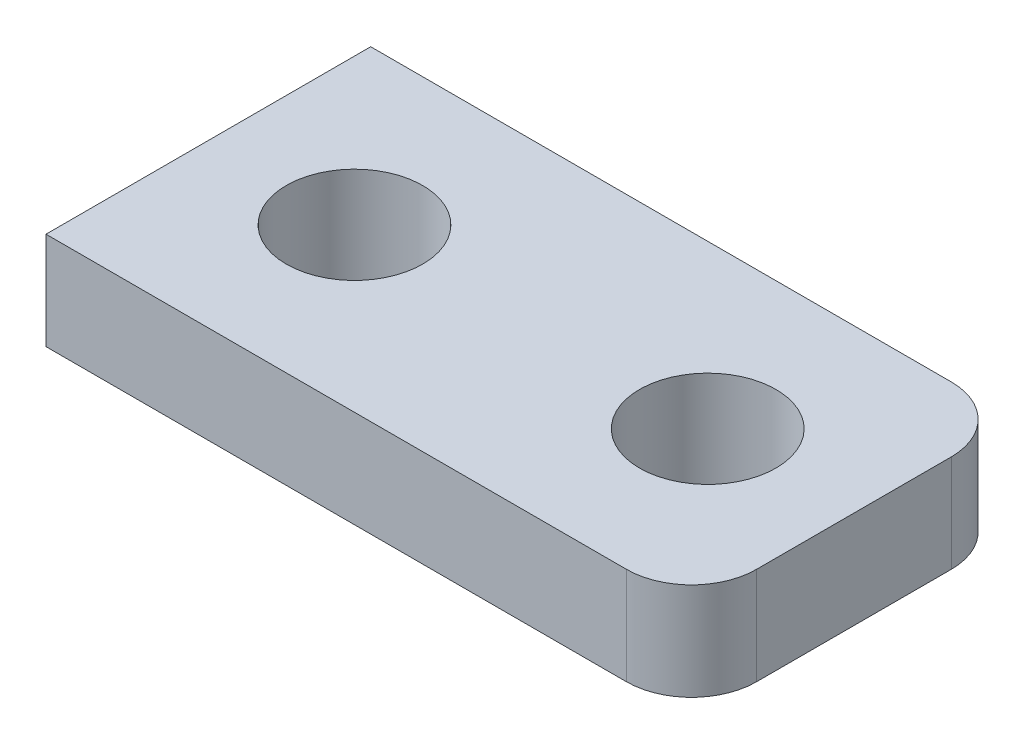
ISO-10303-21;
HEADER;
FILE_DESCRIPTION(('STEP AP214'),'2;1');
FILE_NAME('part.step','',(''),(''),'','','');
FILE_SCHEMA(('AUTOMOTIVE_DESIGN { 1 0 10303 214 1 1 1 1 }'));
ENDSEC;
DATA;
#1=APPLICATION_CONTEXT('core data for automotive mechanical design processes');
#2=APPLICATION_PROTOCOL_DEFINITION('international standard','automotive_design',2000,#1);
#3=PRODUCT_CONTEXT('',#1,'mechanical');
#4=PRODUCT('Part','Part','',(#3));
#5=PRODUCT_RELATED_PRODUCT_CATEGORY('part','',(#4));
#6=PRODUCT_DEFINITION_FORMATION('','',#4);
#7=PRODUCT_DEFINITION_CONTEXT('part definition',#1,'design');
#8=PRODUCT_DEFINITION('design','',#6,#7);
#9=PRODUCT_DEFINITION_SHAPE('','',#8);
#10=(LENGTH_UNIT() NAMED_UNIT(*) SI_UNIT(.MILLI.,.METRE.));
#11=(NAMED_UNIT(*) PLANE_ANGLE_UNIT() SI_UNIT($,.RADIAN.));
#12=(NAMED_UNIT(*) SI_UNIT($,.STERADIAN.) SOLID_ANGLE_UNIT());
#13=UNCERTAINTY_MEASURE_WITH_UNIT(LENGTH_MEASURE(1.E-05),#10,'distance_accuracy_value','');
#14=(GEOMETRIC_REPRESENTATION_CONTEXT(3) GLOBAL_UNCERTAINTY_ASSIGNED_CONTEXT((#13)) GLOBAL_UNIT_ASSIGNED_CONTEXT((#10,
#11,#12)) REPRESENTATION_CONTEXT('',''));
#15=CARTESIAN_POINT('',(0.,0.,0.));
#16=DIRECTION('',(0.,0.,1.));
#17=DIRECTION('',(1.,0.,0.));
#18=AXIS2_PLACEMENT_3D('',#15,#16,#17);
#19=CARTESIAN_POINT('',(0.,3.,0.));
#20=DIRECTION('',(1.,0.,0.));
#21=DIRECTION('',(0.,0.,-1.));
#22=AXIS2_PLACEMENT_3D('',#19,#20,#21);
#23=PLANE('',#22);
#24=DIRECTION('',(0.,0.,1.));
#25=VECTOR('',#24,1.);
#26=CARTESIAN_POINT('',(0.,0.,0.));
#27=LINE('',#26,#25);
#28=CARTESIAN_POINT('',(0.,0.,-10.));
#29=VERTEX_POINT('',#28);
#30=CARTESIAN_POINT('',(0.,0.,0.));
#31=VERTEX_POINT('',#30);
#32=EDGE_CURVE('E113',#29,#31,#27,.T.);
#33=ORIENTED_EDGE('',*,*,#32,.T.);
#34=DIRECTION('',(0.,-1.,0.));
#35=VECTOR('',#34,1.);
#36=CARTESIAN_POINT('',(0.,3.,0.));
#37=LINE('',#36,#35);
#38=CARTESIAN_POINT('',(0.,3.,0.));
#39=VERTEX_POINT('',#38);
#40=EDGE_CURVE('E96',#39,#31,#37,.T.);
#41=ORIENTED_EDGE('',*,*,#40,.F.);
#42=DIRECTION('',(0.,0.,1.));
#43=VECTOR('',#42,1.);
#44=CARTESIAN_POINT('',(0.,3.,0.));
#45=LINE('',#44,#43);
#46=CARTESIAN_POINT('',(0.,3.,-10.));
#47=VERTEX_POINT('',#46);
#48=EDGE_CURVE('E101',#47,#39,#45,.T.);
#49=ORIENTED_EDGE('',*,*,#48,.F.);
#50=DIRECTION('',(0.,-1.,0.));
#51=VECTOR('',#50,1.);
#52=CARTESIAN_POINT('',(0.,3.,-10.));
#53=LINE('',#52,#51);
#54=EDGE_CURVE('E116',#47,#29,#53,.T.);
#55=ORIENTED_EDGE('',*,*,#54,.T.);
#56=EDGE_LOOP('',(#33,#41,#49,#55));
#57=FACE_BOUND('',#56,.T.);
#58=ADVANCED_FACE('F38',(#57),#23,.F.);
#59=CARTESIAN_POINT('',(0.,3.,0.));
#60=DIRECTION('',(0.,0.,-1.));
#61=DIRECTION('',(-1.,0.,0.));
#62=AXIS2_PLACEMENT_3D('',#59,#60,#61);
#63=PLANE('',#62);
#64=DIRECTION('',(1.,0.,0.));
#65=VECTOR('',#64,1.);
#66=CARTESIAN_POINT('',(0.,0.,0.));
#67=LINE('',#66,#65);
#68=CARTESIAN_POINT('',(17.88,0.,0.));
#69=VERTEX_POINT('',#68);
#70=EDGE_CURVE('E151',#31,#69,#67,.T.);
#71=ORIENTED_EDGE('',*,*,#70,.T.);
#72=DIRECTION('',(0.,-1.,0.));
#73=VECTOR('',#72,1.);
#74=CARTESIAN_POINT('',(17.88,3.,0.));
#75=LINE('',#74,#73);
#76=CARTESIAN_POINT('',(17.88,3.,0.));
#77=VERTEX_POINT('',#76);
#78=EDGE_CURVE('E62',#69,#77,#75,.F.);
#79=ORIENTED_EDGE('',*,*,#78,.T.);
#80=DIRECTION('',(1.,0.,0.));
#81=VECTOR('',#80,1.);
#82=CARTESIAN_POINT('',(0.,3.,0.));
#83=LINE('',#82,#81);
#84=EDGE_CURVE('E92',#39,#77,#83,.T.);
#85=ORIENTED_EDGE('',*,*,#84,.F.);
#86=ORIENTED_EDGE('',*,*,#40,.T.);
#87=EDGE_LOOP('',(#71,#79,#85,#86));
#88=FACE_BOUND('',#87,.T.);
#89=ADVANCED_FACE('F94',(#88),#63,.F.);
#90=CARTESIAN_POINT('',(19.88,3.,0.));
#91=DIRECTION('',(-1.,0.,0.));
#92=DIRECTION('',(0.,0.,1.));
#93=AXIS2_PLACEMENT_3D('',#90,#91,#92);
#94=PLANE('',#93);
#95=DIRECTION('',(0.,0.,-1.));
#96=VECTOR('',#95,1.);
#97=CARTESIAN_POINT('',(19.88,3.,0.));
#98=LINE('',#97,#96);
#99=CARTESIAN_POINT('',(19.88,3.,-2.));
#100=VERTEX_POINT('',#99);
#101=CARTESIAN_POINT('',(19.88,3.,-8.));
#102=VERTEX_POINT('',#101);
#103=EDGE_CURVE('E100',#100,#102,#98,.T.);
#104=ORIENTED_EDGE('',*,*,#103,.F.);
#105=DIRECTION('',(0.,-1.,0.));
#106=VECTOR('',#105,1.);
#107=CARTESIAN_POINT('',(19.88,3.,-2.));
#108=LINE('',#107,#106);
#109=CARTESIAN_POINT('',(19.88,0.,-2.));
#110=VERTEX_POINT('',#109);
#111=EDGE_CURVE('E120',#100,#110,#108,.T.);
#112=ORIENTED_EDGE('',*,*,#111,.T.);
#113=DIRECTION('',(0.,0.,-1.));
#114=VECTOR('',#113,1.);
#115=CARTESIAN_POINT('',(19.88,0.,0.));
#116=LINE('',#115,#114);
#117=CARTESIAN_POINT('',(19.88,0.,-8.));
#118=VERTEX_POINT('',#117);
#119=EDGE_CURVE('E152',#110,#118,#116,.T.);
#120=ORIENTED_EDGE('',*,*,#119,.T.);
#121=DIRECTION('',(0.,-1.,0.));
#122=VECTOR('',#121,1.);
#123=CARTESIAN_POINT('',(19.88,3.,-8.));
#124=LINE('',#123,#122);
#125=EDGE_CURVE('E115',#118,#102,#124,.F.);
#126=ORIENTED_EDGE('',*,*,#125,.T.);
#127=EDGE_LOOP('',(#104,#112,#120,#126));
#128=FACE_BOUND('',#127,.T.);
#129=ADVANCED_FACE('F142',(#128),#94,.F.);
#130=CARTESIAN_POINT('',(0.,3.,-10.));
#131=DIRECTION('',(0.,0.,1.));
#132=DIRECTION('',(1.,0.,0.));
#133=AXIS2_PLACEMENT_3D('',#130,#131,#132);
#134=PLANE('',#133);
#135=DIRECTION('',(-1.,0.,0.));
#136=VECTOR('',#135,1.);
#137=CARTESIAN_POINT('',(0.,3.,-10.));
#138=LINE('',#137,#136);
#139=CARTESIAN_POINT('',(17.88,3.,-10.));
#140=VERTEX_POINT('',#139);
#141=EDGE_CURVE('E105',#140,#47,#138,.T.);
#142=ORIENTED_EDGE('',*,*,#141,.F.);
#143=DIRECTION('',(0.,-1.,0.));
#144=VECTOR('',#143,1.);
#145=CARTESIAN_POINT('',(17.88,3.,-10.));
#146=LINE('',#145,#144);
#147=CARTESIAN_POINT('',(17.88,0.,-10.));
#148=VERTEX_POINT('',#147);
#149=EDGE_CURVE('E11',#140,#148,#146,.T.);
#150=ORIENTED_EDGE('',*,*,#149,.T.);
#151=DIRECTION('',(-1.,0.,0.));
#152=VECTOR('',#151,1.);
#153=CARTESIAN_POINT('',(0.,0.,-10.));
#154=LINE('',#153,#152);
#155=EDGE_CURVE('E110',#148,#29,#154,.T.);
#156=ORIENTED_EDGE('',*,*,#155,.T.);
#157=ORIENTED_EDGE('',*,*,#54,.F.);
#158=EDGE_LOOP('',(#142,#150,#156,#157));
#159=FACE_BOUND('',#158,.T.);
#160=ADVANCED_FACE('F164',(#159),#134,.F.);
#161=CARTESIAN_POINT('',(0.,3.,0.));
#162=DIRECTION('',(0.,-1.,0.));
#163=DIRECTION('',(0.,0.,-1.));
#164=AXIS2_PLACEMENT_3D('',#161,#162,#163);
#165=PLANE('',#164);
#166=CARTESIAN_POINT('',(4.5,3.,-5.));
#167=DIRECTION('',(0.,1.,0.));
#168=DIRECTION('',(0.,0.,1.));
#169=AXIS2_PLACEMENT_3D('',#166,#167,#168);
#170=CIRCLE('',#169,2.1);
#171=CARTESIAN_POINT('',(4.5,3.,-2.9));
#172=VERTEX_POINT('',#171);
#173=EDGE_CURVE('E202',#172,#172,#170,.T.);
#174=ORIENTED_EDGE('',*,*,#173,.F.);
#175=EDGE_LOOP('',(#174));
#176=FACE_BOUND('',#175,.T.);
#177=CARTESIAN_POINT('',(15.38,3.,-5.));
#178=DIRECTION('',(0.,1.,0.));
#179=DIRECTION('',(0.,0.,1.));
#180=AXIS2_PLACEMENT_3D('',#177,#178,#179);
#181=CIRCLE('',#180,2.1);
#182=CARTESIAN_POINT('',(15.38,3.,-2.9));
#183=VERTEX_POINT('',#182);
#184=EDGE_CURVE('E210',#183,#183,#181,.T.);
#185=ORIENTED_EDGE('',*,*,#184,.F.);
#186=EDGE_LOOP('',(#185));
#187=FACE_BOUND('',#186,.T.);
#188=ORIENTED_EDGE('',*,*,#84,.T.);
#189=CARTESIAN_POINT('',(17.88,3.,-2.));
#190=DIRECTION('',(0.,-1.,0.));
#191=DIRECTION('',(0.,0.,-1.));
#192=AXIS2_PLACEMENT_3D('',#189,#190,#191);
#193=CIRCLE('',#192,2.);
#194=EDGE_CURVE('E47',#77,#100,#193,.F.);
#195=ORIENTED_EDGE('',*,*,#194,.T.);
#196=ORIENTED_EDGE('',*,*,#103,.T.);
#197=CARTESIAN_POINT('',(17.88,3.,-8.));
#198=DIRECTION('',(0.,-1.,0.));
#199=DIRECTION('',(0.,0.,-1.));
#200=AXIS2_PLACEMENT_3D('',#197,#198,#199);
#201=CIRCLE('',#200,2.);
#202=EDGE_CURVE('E54',#102,#140,#201,.F.);
#203=ORIENTED_EDGE('',*,*,#202,.T.);
#204=ORIENTED_EDGE('',*,*,#141,.T.);
#205=ORIENTED_EDGE('',*,*,#48,.T.);
#206=EDGE_LOOP('',(#188,#195,#196,#203,#204,#205));
#207=FACE_BOUND('',#206,.T.);
#208=ADVANCED_FACE('F104',(#176,#187,#207),#165,.F.);
#209=CARTESIAN_POINT('',(0.,0.,0.));
#210=DIRECTION('',(0.,-1.,0.));
#211=DIRECTION('',(0.,0.,-1.));
#212=AXIS2_PLACEMENT_3D('',#209,#210,#211);
#213=PLANE('',#212);
#214=CARTESIAN_POINT('',(4.5,0.,-5.));
#215=DIRECTION('',(0.,1.,0.));
#216=DIRECTION('',(0.,0.,1.));
#217=AXIS2_PLACEMENT_3D('',#214,#215,#216);
#218=CIRCLE('',#217,2.1);
#219=CARTESIAN_POINT('',(4.5,0.,-2.9));
#220=VERTEX_POINT('',#219);
#221=EDGE_CURVE('E158',#220,#220,#218,.T.);
#222=ORIENTED_EDGE('',*,*,#221,.T.);
#223=EDGE_LOOP('',(#222));
#224=FACE_BOUND('',#223,.T.);
#225=CARTESIAN_POINT('',(15.38,0.,-5.));
#226=DIRECTION('',(0.,1.,0.));
#227=DIRECTION('',(0.,0.,1.));
#228=AXIS2_PLACEMENT_3D('',#225,#226,#227);
#229=CIRCLE('',#228,2.1);
#230=CARTESIAN_POINT('',(15.38,0.,-2.9));
#231=VERTEX_POINT('',#230);
#232=EDGE_CURVE('E204',#231,#231,#229,.T.);
#233=ORIENTED_EDGE('',*,*,#232,.T.);
#234=EDGE_LOOP('',(#233));
#235=FACE_BOUND('',#234,.T.);
#236=ORIENTED_EDGE('',*,*,#119,.F.);
#237=CARTESIAN_POINT('',(17.88,0.,-2.));
#238=DIRECTION('',(0.,-1.,0.));
#239=DIRECTION('',(0.,0.,-1.));
#240=AXIS2_PLACEMENT_3D('',#237,#238,#239);
#241=CIRCLE('',#240,2.);
#242=EDGE_CURVE('E131',#110,#69,#241,.T.);
#243=ORIENTED_EDGE('',*,*,#242,.T.);
#244=ORIENTED_EDGE('',*,*,#70,.F.);
#245=ORIENTED_EDGE('',*,*,#32,.F.);
#246=ORIENTED_EDGE('',*,*,#155,.F.);
#247=CARTESIAN_POINT('',(17.88,0.,-8.));
#248=DIRECTION('',(0.,-1.,0.));
#249=DIRECTION('',(0.,0.,-1.));
#250=AXIS2_PLACEMENT_3D('',#247,#248,#249);
#251=CIRCLE('',#250,2.);
#252=EDGE_CURVE('E128',#148,#118,#251,.T.);
#253=ORIENTED_EDGE('',*,*,#252,.T.);
#254=EDGE_LOOP('',(#236,#243,#244,#245,#246,#253));
#255=FACE_BOUND('',#254,.T.);
#256=ADVANCED_FACE('F150',(#224,#235,#255),#213,.T.);
#257=CARTESIAN_POINT('',(17.88,3.,-2.));
#258=DIRECTION('',(0.,-1.,0.));
#259=DIRECTION('',(0.,0.,-1.));
#260=AXIS2_PLACEMENT_3D('',#257,#258,#259);
#261=CYLINDRICAL_SURFACE('',#260,2.);
#262=ORIENTED_EDGE('',*,*,#194,.F.);
#263=ORIENTED_EDGE('',*,*,#78,.F.);
#264=ORIENTED_EDGE('',*,*,#242,.F.);
#265=ORIENTED_EDGE('',*,*,#111,.F.);
#266=EDGE_LOOP('',(#262,#263,#264,#265));
#267=FACE_BOUND('',#266,.T.);
#268=ADVANCED_FACE('F148',(#267),#261,.T.);
#269=CARTESIAN_POINT('',(17.88,3.,-8.));
#270=DIRECTION('',(0.,-1.,0.));
#271=DIRECTION('',(0.,0.,-1.));
#272=AXIS2_PLACEMENT_3D('',#269,#270,#271);
#273=CYLINDRICAL_SURFACE('',#272,2.);
#274=ORIENTED_EDGE('',*,*,#202,.F.);
#275=ORIENTED_EDGE('',*,*,#125,.F.);
#276=ORIENTED_EDGE('',*,*,#252,.F.);
#277=ORIENTED_EDGE('',*,*,#149,.F.);
#278=EDGE_LOOP('',(#274,#275,#276,#277));
#279=FACE_BOUND('',#278,.T.);
#280=ADVANCED_FACE('F40',(#279),#273,.T.);
#281=CARTESIAN_POINT('',(15.38,0.,-5.));
#282=DIRECTION('',(0.,1.,0.));
#283=DIRECTION('',(0.,0.,1.));
#284=AXIS2_PLACEMENT_3D('',#281,#282,#283);
#285=CYLINDRICAL_SURFACE('',#284,2.1);
#286=ORIENTED_EDGE('',*,*,#232,.F.);
#287=EDGE_LOOP('',(#286));
#288=FACE_BOUND('',#287,.T.);
#289=ORIENTED_EDGE('',*,*,#184,.T.);
#290=EDGE_LOOP('',(#289));
#291=FACE_BOUND('',#290,.T.);
#292=ADVANCED_FACE('F168',(#288,#291),#285,.F.);
#293=CARTESIAN_POINT('',(4.5,0.,-5.));
#294=DIRECTION('',(0.,1.,0.));
#295=DIRECTION('',(0.,0.,1.));
#296=AXIS2_PLACEMENT_3D('',#293,#294,#295);
#297=CYLINDRICAL_SURFACE('',#296,2.1);
#298=ORIENTED_EDGE('',*,*,#221,.F.);
#299=EDGE_LOOP('',(#298));
#300=FACE_BOUND('',#299,.T.);
#301=ORIENTED_EDGE('',*,*,#173,.T.);
#302=EDGE_LOOP('',(#301));
#303=FACE_BOUND('',#302,.T.);
#304=ADVANCED_FACE('F173',(#300,#303),#297,.F.);
#305=CLOSED_SHELL('',(#58,#89,#129,#160,#208,#256,#268,#280,#292,#304));
#306=MANIFOLD_SOLID_BREP('B2',#305);
#307=ADVANCED_BREP_SHAPE_REPRESENTATION('',(#18,#306),#14);
#308=SHAPE_DEFINITION_REPRESENTATION(#9,#307);
ENDSEC;
END-ISO-10303-21;
